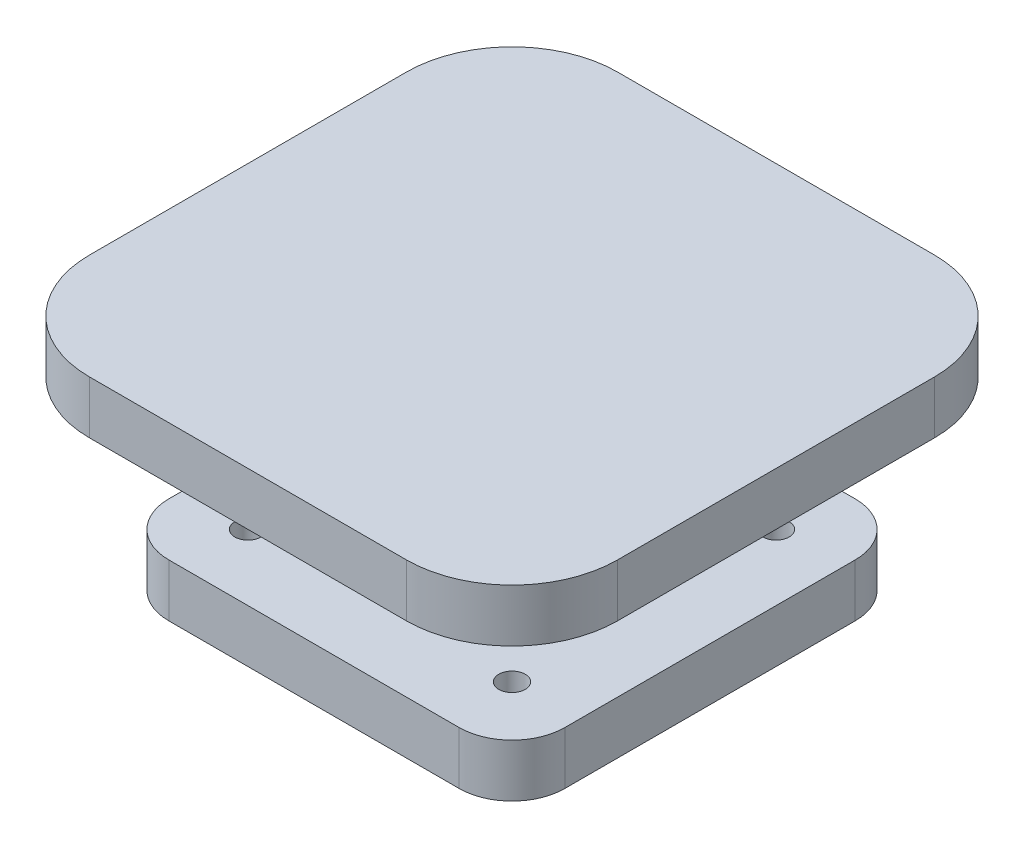
ISO-10303-21;
HEADER;
FILE_DESCRIPTION(('STEP AP214'),'2;1');
FILE_NAME('part.step','',(''),(''),'','','');
FILE_SCHEMA(('AUTOMOTIVE_DESIGN { 1 0 10303 214 1 1 1 1 }'));
ENDSEC;
DATA;
#1=APPLICATION_CONTEXT('core data for automotive mechanical design processes');
#2=APPLICATION_PROTOCOL_DEFINITION('international standard','automotive_design',2000,#1);
#3=PRODUCT_CONTEXT('',#1,'mechanical');
#4=PRODUCT('Part','Part','',(#3));
#5=PRODUCT_RELATED_PRODUCT_CATEGORY('part','',(#4));
#6=PRODUCT_DEFINITION_FORMATION('','',#4);
#7=PRODUCT_DEFINITION_CONTEXT('part definition',#1,'design');
#8=PRODUCT_DEFINITION('design','',#6,#7);
#9=PRODUCT_DEFINITION_SHAPE('','',#8);
#10=(LENGTH_UNIT() NAMED_UNIT(*) SI_UNIT(.MILLI.,.METRE.));
#11=(NAMED_UNIT(*) PLANE_ANGLE_UNIT() SI_UNIT($,.RADIAN.));
#12=(NAMED_UNIT(*) SI_UNIT($,.STERADIAN.) SOLID_ANGLE_UNIT());
#13=UNCERTAINTY_MEASURE_WITH_UNIT(LENGTH_MEASURE(1.E-05),#10,'distance_accuracy_value','');
#14=(GEOMETRIC_REPRESENTATION_CONTEXT(3) GLOBAL_UNCERTAINTY_ASSIGNED_CONTEXT((#13)) GLOBAL_UNIT_ASSIGNED_CONTEXT((#10,
#11,#12)) REPRESENTATION_CONTEXT('',''));
#15=CARTESIAN_POINT('',(0.,0.,0.));
#16=DIRECTION('',(0.,0.,1.));
#17=DIRECTION('',(1.,0.,0.));
#18=AXIS2_PLACEMENT_3D('',#15,#16,#17);
#19=CARTESIAN_POINT('',(0.,20.,75.));
#20=DIRECTION('',(0.,0.,-1.));
#21=DIRECTION('',(-1.,0.,0.));
#22=AXIS2_PLACEMENT_3D('',#19,#20,#21);
#23=PLANE('',#22);
#24=DIRECTION('',(1.,0.,0.));
#25=VECTOR('',#24,1.);
#26=CARTESIAN_POINT('',(0.,0.,75.));
#27=LINE('',#26,#25);
#28=CARTESIAN_POINT('',(-55.,0.,75.));
#29=VERTEX_POINT('',#28);
#30=CARTESIAN_POINT('',(55.,0.,75.));
#31=VERTEX_POINT('',#30);
#32=EDGE_CURVE('E162',#29,#31,#27,.T.);
#33=ORIENTED_EDGE('',*,*,#32,.T.);
#34=DIRECTION('',(0.,-1.,0.));
#35=VECTOR('',#34,1.);
#36=CARTESIAN_POINT('',(55.,20.,75.));
#37=LINE('',#36,#35);
#38=CARTESIAN_POINT('',(55.,20.,75.));
#39=VERTEX_POINT('',#38);
#40=EDGE_CURVE('E231',#31,#39,#37,.F.);
#41=ORIENTED_EDGE('',*,*,#40,.T.);
#42=DIRECTION('',(1.,0.,0.));
#43=VECTOR('',#42,1.);
#44=CARTESIAN_POINT('',(0.,20.,75.));
#45=LINE('',#44,#43);
#46=CARTESIAN_POINT('',(-55.,20.,75.));
#47=VERTEX_POINT('',#46);
#48=EDGE_CURVE('E344',#47,#39,#45,.T.);
#49=ORIENTED_EDGE('',*,*,#48,.F.);
#50=DIRECTION('',(0.,-1.,0.));
#51=VECTOR('',#50,1.);
#52=CARTESIAN_POINT('',(-55.,0.,75.));
#53=LINE('',#52,#51);
#54=EDGE_CURVE('E228',#47,#29,#53,.T.);
#55=ORIENTED_EDGE('',*,*,#54,.T.);
#56=EDGE_LOOP('',(#33,#41,#49,#55));
#57=FACE_BOUND('',#56,.T.);
#58=ADVANCED_FACE('F41',(#57),#23,.F.);
#59=CARTESIAN_POINT('',(75.,20.,0.));
#60=DIRECTION('',(-1.,0.,0.));
#61=DIRECTION('',(0.,0.,1.));
#62=AXIS2_PLACEMENT_3D('',#59,#60,#61);
#63=PLANE('',#62);
#64=DIRECTION('',(0.,0.,-1.));
#65=VECTOR('',#64,1.);
#66=CARTESIAN_POINT('',(75.,0.,0.));
#67=LINE('',#66,#65);
#68=CARTESIAN_POINT('',(75.,0.,55.));
#69=VERTEX_POINT('',#68);
#70=CARTESIAN_POINT('',(75.,0.,-55.));
#71=VERTEX_POINT('',#70);
#72=EDGE_CURVE('E372',#69,#71,#67,.T.);
#73=ORIENTED_EDGE('',*,*,#72,.T.);
#74=DIRECTION('',(0.,-1.,0.));
#75=VECTOR('',#74,1.);
#76=CARTESIAN_POINT('',(75.,20.,-55.));
#77=LINE('',#76,#75);
#78=CARTESIAN_POINT('',(75.,20.,-55.));
#79=VERTEX_POINT('',#78);
#80=EDGE_CURVE('E225',#71,#79,#77,.F.);
#81=ORIENTED_EDGE('',*,*,#80,.T.);
#82=DIRECTION('',(0.,0.,-1.));
#83=VECTOR('',#82,1.);
#84=CARTESIAN_POINT('',(75.,20.,0.));
#85=LINE('',#84,#83);
#86=CARTESIAN_POINT('',(75.,20.,55.));
#87=VERTEX_POINT('',#86);
#88=EDGE_CURVE('E348',#87,#79,#85,.T.);
#89=ORIENTED_EDGE('',*,*,#88,.F.);
#90=DIRECTION('',(0.,-1.,0.));
#91=VECTOR('',#90,1.);
#92=CARTESIAN_POINT('',(75.,20.,55.));
#93=LINE('',#92,#91);
#94=EDGE_CURVE('E221',#87,#69,#93,.T.);
#95=ORIENTED_EDGE('',*,*,#94,.T.);
#96=EDGE_LOOP('',(#73,#81,#89,#95));
#97=FACE_BOUND('',#96,.T.);
#98=ADVANCED_FACE('F395',(#97),#63,.F.);
#99=CARTESIAN_POINT('',(0.,20.,-75.));
#100=DIRECTION('',(0.,0.,-1.));
#101=DIRECTION('',(-1.,0.,0.));
#102=AXIS2_PLACEMENT_3D('',#99,#100,#101);
#103=PLANE('',#102);
#104=DIRECTION('',(1.,0.,0.));
#105=VECTOR('',#104,1.);
#106=CARTESIAN_POINT('',(0.,0.,-75.));
#107=LINE('',#106,#105);
#108=CARTESIAN_POINT('',(-55.,0.,-75.));
#109=VERTEX_POINT('',#108);
#110=CARTESIAN_POINT('',(55.,0.,-75.));
#111=VERTEX_POINT('',#110);
#112=EDGE_CURVE('E180',#109,#111,#107,.T.);
#113=ORIENTED_EDGE('',*,*,#112,.F.);
#114=DIRECTION('',(0.,-1.,0.));
#115=VECTOR('',#114,1.);
#116=CARTESIAN_POINT('',(-55.,20.,-75.));
#117=LINE('',#116,#115);
#118=CARTESIAN_POINT('',(-55.,20.,-75.));
#119=VERTEX_POINT('',#118);
#120=EDGE_CURVE('E207',#109,#119,#117,.F.);
#121=ORIENTED_EDGE('',*,*,#120,.T.);
#122=DIRECTION('',(1.,0.,0.));
#123=VECTOR('',#122,1.);
#124=CARTESIAN_POINT('',(0.,20.,-75.));
#125=LINE('',#124,#123);
#126=CARTESIAN_POINT('',(55.,20.,-75.));
#127=VERTEX_POINT('',#126);
#128=EDGE_CURVE('E191',#119,#127,#125,.T.);
#129=ORIENTED_EDGE('',*,*,#128,.T.);
#130=DIRECTION('',(0.,-1.,0.));
#131=VECTOR('',#130,1.);
#132=CARTESIAN_POINT('',(55.,0.,-75.));
#133=LINE('',#132,#131);
#134=EDGE_CURVE('E203',#127,#111,#133,.T.);
#135=ORIENTED_EDGE('',*,*,#134,.T.);
#136=EDGE_LOOP('',(#113,#121,#129,#135));
#137=FACE_BOUND('',#136,.T.);
#138=ADVANCED_FACE('F381',(#137),#103,.T.);
#139=CARTESIAN_POINT('',(50.,20.,50.));
#140=DIRECTION('',(0.,-1.,0.));
#141=DIRECTION('',(0.,0.,-1.));
#142=AXIS2_PLACEMENT_3D('',#139,#140,#141);
#143=CYLINDRICAL_SURFACE('',#142,5.);
#144=CARTESIAN_POINT('',(50.,20.,50.));
#145=DIRECTION('',(0.,1.,0.));
#146=DIRECTION('',(0.,0.,1.));
#147=AXIS2_PLACEMENT_3D('',#144,#145,#146);
#148=CIRCLE('',#147,5.);
#149=CARTESIAN_POINT('',(50.,20.,55.));
#150=VERTEX_POINT('',#149);
#151=EDGE_CURVE('E340',#150,#150,#148,.T.);
#152=ORIENTED_EDGE('',*,*,#151,.T.);
#153=EDGE_LOOP('',(#152));
#154=FACE_BOUND('',#153,.T.);
#155=CARTESIAN_POINT('',(50.,0.,50.));
#156=DIRECTION('',(0.,1.,0.));
#157=DIRECTION('',(0.,0.,1.));
#158=AXIS2_PLACEMENT_3D('',#155,#156,#157);
#159=CIRCLE('',#158,5.);
#160=CARTESIAN_POINT('',(50.,0.,55.));
#161=VERTEX_POINT('',#160);
#162=EDGE_CURVE('E366',#161,#161,#159,.T.);
#163=ORIENTED_EDGE('',*,*,#162,.F.);
#164=EDGE_LOOP('',(#163));
#165=FACE_BOUND('',#164,.T.);
#166=ADVANCED_FACE('F411',(#154,#165),#143,.F.);
#167=CARTESIAN_POINT('',(-50.,20.,50.));
#168=DIRECTION('',(0.,-1.,0.));
#169=DIRECTION('',(0.,0.,-1.));
#170=AXIS2_PLACEMENT_3D('',#167,#168,#169);
#171=CYLINDRICAL_SURFACE('',#170,5.);
#172=CARTESIAN_POINT('',(-50.,20.,50.));
#173=DIRECTION('',(0.,1.,0.));
#174=DIRECTION('',(0.,0.,1.));
#175=AXIS2_PLACEMENT_3D('',#172,#173,#174);
#176=CIRCLE('',#175,5.);
#177=CARTESIAN_POINT('',(-50.,20.,55.));
#178=VERTEX_POINT('',#177);
#179=EDGE_CURVE('E336',#178,#178,#176,.T.);
#180=ORIENTED_EDGE('',*,*,#179,.T.);
#181=EDGE_LOOP('',(#180));
#182=FACE_BOUND('',#181,.T.);
#183=CARTESIAN_POINT('',(-50.,0.,50.));
#184=DIRECTION('',(0.,1.,0.));
#185=DIRECTION('',(0.,0.,1.));
#186=AXIS2_PLACEMENT_3D('',#183,#184,#185);
#187=CIRCLE('',#186,5.);
#188=CARTESIAN_POINT('',(-50.,0.,55.));
#189=VERTEX_POINT('',#188);
#190=EDGE_CURVE('E362',#189,#189,#187,.T.);
#191=ORIENTED_EDGE('',*,*,#190,.F.);
#192=EDGE_LOOP('',(#191));
#193=FACE_BOUND('',#192,.T.);
#194=ADVANCED_FACE('F414',(#182,#193),#171,.F.);
#195=CARTESIAN_POINT('',(50.,20.,-50.));
#196=DIRECTION('',(0.,-1.,0.));
#197=DIRECTION('',(0.,0.,-1.));
#198=AXIS2_PLACEMENT_3D('',#195,#196,#197);
#199=CYLINDRICAL_SURFACE('',#198,5.);
#200=CARTESIAN_POINT('',(50.,20.,-50.));
#201=DIRECTION('',(0.,1.,0.));
#202=DIRECTION('',(0.,0.,1.));
#203=AXIS2_PLACEMENT_3D('',#200,#201,#202);
#204=CIRCLE('',#203,5.);
#205=CARTESIAN_POINT('',(50.,20.,-45.));
#206=VERTEX_POINT('',#205);
#207=EDGE_CURVE('E332',#206,#206,#204,.T.);
#208=ORIENTED_EDGE('',*,*,#207,.T.);
#209=EDGE_LOOP('',(#208));
#210=FACE_BOUND('',#209,.T.);
#211=CARTESIAN_POINT('',(50.,0.,-50.));
#212=DIRECTION('',(0.,1.,0.));
#213=DIRECTION('',(0.,0.,1.));
#214=AXIS2_PLACEMENT_3D('',#211,#212,#213);
#215=CIRCLE('',#214,5.);
#216=CARTESIAN_POINT('',(50.,0.,-45.));
#217=VERTEX_POINT('',#216);
#218=EDGE_CURVE('E358',#217,#217,#215,.T.);
#219=ORIENTED_EDGE('',*,*,#218,.F.);
#220=EDGE_LOOP('',(#219));
#221=FACE_BOUND('',#220,.T.);
#222=ADVANCED_FACE('F418',(#210,#221),#199,.F.);
#223=CARTESIAN_POINT('',(-50.,20.,-50.));
#224=DIRECTION('',(0.,-1.,0.));
#225=DIRECTION('',(0.,0.,-1.));
#226=AXIS2_PLACEMENT_3D('',#223,#224,#225);
#227=CYLINDRICAL_SURFACE('',#226,5.);
#228=CARTESIAN_POINT('',(-50.,20.,-50.));
#229=DIRECTION('',(0.,1.,0.));
#230=DIRECTION('',(0.,0.,1.));
#231=AXIS2_PLACEMENT_3D('',#228,#229,#230);
#232=CIRCLE('',#231,5.);
#233=CARTESIAN_POINT('',(-50.,20.,-45.));
#234=VERTEX_POINT('',#233);
#235=EDGE_CURVE('E179',#234,#234,#232,.T.);
#236=ORIENTED_EDGE('',*,*,#235,.T.);
#237=EDGE_LOOP('',(#236));
#238=FACE_BOUND('',#237,.T.);
#239=CARTESIAN_POINT('',(-50.,0.,-50.));
#240=DIRECTION('',(0.,1.,0.));
#241=DIRECTION('',(0.,0.,1.));
#242=AXIS2_PLACEMENT_3D('',#239,#240,#241);
#243=CIRCLE('',#242,5.);
#244=CARTESIAN_POINT('',(-50.,0.,-45.));
#245=VERTEX_POINT('',#244);
#246=EDGE_CURVE('E323',#245,#245,#243,.T.);
#247=ORIENTED_EDGE('',*,*,#246,.F.);
#248=EDGE_LOOP('',(#247));
#249=FACE_BOUND('',#248,.T.);
#250=ADVANCED_FACE('F422',(#238,#249),#227,.F.);
#251=CARTESIAN_POINT('',(-75.,20.,0.));
#252=DIRECTION('',(-1.,0.,0.));
#253=DIRECTION('',(0.,0.,1.));
#254=AXIS2_PLACEMENT_3D('',#251,#252,#253);
#255=PLANE('',#254);
#256=DIRECTION('',(0.,0.,-1.));
#257=VECTOR('',#256,1.);
#258=CARTESIAN_POINT('',(-75.,20.,0.));
#259=LINE('',#258,#257);
#260=CARTESIAN_POINT('',(-75.,20.,55.));
#261=VERTEX_POINT('',#260);
#262=CARTESIAN_POINT('',(-75.,20.,-55.));
#263=VERTEX_POINT('',#262);
#264=EDGE_CURVE('E186',#261,#263,#259,.T.);
#265=ORIENTED_EDGE('',*,*,#264,.T.);
#266=DIRECTION('',(0.,-1.,0.));
#267=VECTOR('',#266,1.);
#268=CARTESIAN_POINT('',(-75.,20.,-55.));
#269=LINE('',#268,#267);
#270=CARTESIAN_POINT('',(-75.,0.,-55.));
#271=VERTEX_POINT('',#270);
#272=EDGE_CURVE('E169',#263,#271,#269,.T.);
#273=ORIENTED_EDGE('',*,*,#272,.T.);
#274=DIRECTION('',(0.,0.,-1.));
#275=VECTOR('',#274,1.);
#276=CARTESIAN_POINT('',(-75.,0.,0.));
#277=LINE('',#276,#275);
#278=CARTESIAN_POINT('',(-75.,0.,55.));
#279=VERTEX_POINT('',#278);
#280=EDGE_CURVE('E160',#279,#271,#277,.T.);
#281=ORIENTED_EDGE('',*,*,#280,.F.);
#282=DIRECTION('',(0.,-1.,0.));
#283=VECTOR('',#282,1.);
#284=CARTESIAN_POINT('',(-75.,20.,55.));
#285=LINE('',#284,#283);
#286=EDGE_CURVE('E175',#279,#261,#285,.F.);
#287=ORIENTED_EDGE('',*,*,#286,.T.);
#288=EDGE_LOOP('',(#265,#273,#281,#287));
#289=FACE_BOUND('',#288,.T.);
#290=ADVANCED_FACE('F174',(#289),#255,.T.);
#291=CARTESIAN_POINT('',(0.,20.,0.));
#292=DIRECTION('',(0.,1.,0.));
#293=DIRECTION('',(0.,0.,1.));
#294=AXIS2_PLACEMENT_3D('',#291,#292,#293);
#295=PLANE('',#294);
#296=CARTESIAN_POINT('',(0.,20.,0.));
#297=DIRECTION('',(0.,1.,0.));
#298=DIRECTION('',(0.,0.,1.));
#299=AXIS2_PLACEMENT_3D('',#296,#297,#298);
#300=CIRCLE('',#299,50.);
#301=CARTESIAN_POINT('',(0.,20.,50.));
#302=VERTEX_POINT('',#301);
#303=EDGE_CURVE('E324',#302,#302,#300,.T.);
#304=ORIENTED_EDGE('',*,*,#303,.F.);
#305=EDGE_LOOP('',(#304));
#306=FACE_BOUND('',#305,.T.);
#307=ORIENTED_EDGE('',*,*,#235,.F.);
#308=EDGE_LOOP('',(#307));
#309=FACE_BOUND('',#308,.T.);
#310=ORIENTED_EDGE('',*,*,#207,.F.);
#311=EDGE_LOOP('',(#310));
#312=FACE_BOUND('',#311,.T.);
#313=ORIENTED_EDGE('',*,*,#179,.F.);
#314=EDGE_LOOP('',(#313));
#315=FACE_BOUND('',#314,.T.);
#316=ORIENTED_EDGE('',*,*,#151,.F.);
#317=EDGE_LOOP('',(#316));
#318=FACE_BOUND('',#317,.T.);
#319=ORIENTED_EDGE('',*,*,#128,.F.);
#320=CARTESIAN_POINT('',(-55.,20.,-55.));
#321=DIRECTION('',(0.,1.,0.));
#322=DIRECTION('',(0.,0.,1.));
#323=AXIS2_PLACEMENT_3D('',#320,#321,#322);
#324=CIRCLE('',#323,20.);
#325=EDGE_CURVE('E218',#119,#263,#324,.T.);
#326=ORIENTED_EDGE('',*,*,#325,.T.);
#327=ORIENTED_EDGE('',*,*,#264,.F.);
#328=CARTESIAN_POINT('',(-55.,20.,55.));
#329=DIRECTION('',(0.,1.,0.));
#330=DIRECTION('',(0.,0.,1.));
#331=AXIS2_PLACEMENT_3D('',#328,#329,#330);
#332=CIRCLE('',#331,20.);
#333=EDGE_CURVE('E184',#261,#47,#332,.T.);
#334=ORIENTED_EDGE('',*,*,#333,.T.);
#335=ORIENTED_EDGE('',*,*,#48,.T.);
#336=CARTESIAN_POINT('',(55.,20.,55.));
#337=DIRECTION('',(0.,1.,0.));
#338=DIRECTION('',(0.,0.,1.));
#339=AXIS2_PLACEMENT_3D('',#336,#337,#338);
#340=CIRCLE('',#339,20.);
#341=EDGE_CURVE('E212',#39,#87,#340,.T.);
#342=ORIENTED_EDGE('',*,*,#341,.T.);
#343=ORIENTED_EDGE('',*,*,#88,.T.);
#344=CARTESIAN_POINT('',(55.,20.,-55.));
#345=DIRECTION('',(0.,1.,0.));
#346=DIRECTION('',(0.,0.,1.));
#347=AXIS2_PLACEMENT_3D('',#344,#345,#346);
#348=CIRCLE('',#347,20.);
#349=EDGE_CURVE('E215',#79,#127,#348,.T.);
#350=ORIENTED_EDGE('',*,*,#349,.T.);
#351=EDGE_LOOP('',(#319,#326,#327,#334,#335,#342,#343,#350));
#352=FACE_BOUND('',#351,.T.);
#353=ADVANCED_FACE('F388',(#306,#309,#312,#315,#318,#352),#295,.T.);
#354=CARTESIAN_POINT('',(0.,0.,0.));
#355=DIRECTION('',(0.,1.,0.));
#356=DIRECTION('',(0.,0.,1.));
#357=AXIS2_PLACEMENT_3D('',#354,#355,#356);
#358=PLANE('',#357);
#359=ORIENTED_EDGE('',*,*,#246,.T.);
#360=EDGE_LOOP('',(#359));
#361=FACE_BOUND('',#360,.T.);
#362=ORIENTED_EDGE('',*,*,#218,.T.);
#363=EDGE_LOOP('',(#362));
#364=FACE_BOUND('',#363,.T.);
#365=ORIENTED_EDGE('',*,*,#190,.T.);
#366=EDGE_LOOP('',(#365));
#367=FACE_BOUND('',#366,.T.);
#368=ORIENTED_EDGE('',*,*,#162,.T.);
#369=EDGE_LOOP('',(#368));
#370=FACE_BOUND('',#369,.T.);
#371=ORIENTED_EDGE('',*,*,#280,.T.);
#372=CARTESIAN_POINT('',(-55.,0.,-55.));
#373=DIRECTION('',(0.,1.,0.));
#374=DIRECTION('',(0.,0.,1.));
#375=AXIS2_PLACEMENT_3D('',#372,#373,#374);
#376=CIRCLE('',#375,20.);
#377=EDGE_CURVE('E200',#271,#109,#376,.F.);
#378=ORIENTED_EDGE('',*,*,#377,.T.);
#379=ORIENTED_EDGE('',*,*,#112,.T.);
#380=CARTESIAN_POINT('',(55.,0.,-55.));
#381=DIRECTION('',(0.,1.,0.));
#382=DIRECTION('',(0.,0.,1.));
#383=AXIS2_PLACEMENT_3D('',#380,#381,#382);
#384=CIRCLE('',#383,20.);
#385=EDGE_CURVE('E197',#111,#71,#384,.F.);
#386=ORIENTED_EDGE('',*,*,#385,.T.);
#387=ORIENTED_EDGE('',*,*,#72,.F.);
#388=CARTESIAN_POINT('',(55.,0.,55.));
#389=DIRECTION('',(0.,1.,0.));
#390=DIRECTION('',(0.,0.,1.));
#391=AXIS2_PLACEMENT_3D('',#388,#389,#390);
#392=CIRCLE('',#391,20.);
#393=EDGE_CURVE('E168',#69,#31,#392,.F.);
#394=ORIENTED_EDGE('',*,*,#393,.T.);
#395=ORIENTED_EDGE('',*,*,#32,.F.);
#396=CARTESIAN_POINT('',(-55.,0.,55.));
#397=DIRECTION('',(0.,1.,0.));
#398=DIRECTION('',(0.,0.,1.));
#399=AXIS2_PLACEMENT_3D('',#396,#397,#398);
#400=CIRCLE('',#399,20.);
#401=EDGE_CURVE('E157',#29,#279,#400,.F.);
#402=ORIENTED_EDGE('',*,*,#401,.T.);
#403=EDGE_LOOP('',(#371,#378,#379,#386,#387,#394,#395,#402));
#404=FACE_BOUND('',#403,.T.);
#405=ADVANCED_FACE('F159',(#361,#364,#367,#370,#404),#358,.F.);
#406=CARTESIAN_POINT('',(-55.,20.,-55.));
#407=DIRECTION('',(0.,-1.,0.));
#408=DIRECTION('',(0.,0.,-1.));
#409=AXIS2_PLACEMENT_3D('',#406,#407,#408);
#410=CYLINDRICAL_SURFACE('',#409,20.);
#411=ORIENTED_EDGE('',*,*,#325,.F.);
#412=ORIENTED_EDGE('',*,*,#120,.F.);
#413=ORIENTED_EDGE('',*,*,#377,.F.);
#414=ORIENTED_EDGE('',*,*,#272,.F.);
#415=EDGE_LOOP('',(#411,#412,#413,#414));
#416=FACE_BOUND('',#415,.T.);
#417=ADVANCED_FACE('F386',(#416),#410,.T.);
#418=CARTESIAN_POINT('',(55.,20.,-55.));
#419=DIRECTION('',(0.,1.,0.));
#420=DIRECTION('',(0.,0.,1.));
#421=AXIS2_PLACEMENT_3D('',#418,#419,#420);
#422=CYLINDRICAL_SURFACE('',#421,20.);
#423=ORIENTED_EDGE('',*,*,#349,.F.);
#424=ORIENTED_EDGE('',*,*,#80,.F.);
#425=ORIENTED_EDGE('',*,*,#385,.F.);
#426=ORIENTED_EDGE('',*,*,#134,.F.);
#427=EDGE_LOOP('',(#423,#424,#425,#426));
#428=FACE_BOUND('',#427,.T.);
#429=ADVANCED_FACE('F391',(#428),#422,.T.);
#430=CARTESIAN_POINT('',(55.,20.,55.));
#431=DIRECTION('',(0.,-1.,0.));
#432=DIRECTION('',(0.,0.,-1.));
#433=AXIS2_PLACEMENT_3D('',#430,#431,#432);
#434=CYLINDRICAL_SURFACE('',#433,20.);
#435=ORIENTED_EDGE('',*,*,#341,.F.);
#436=ORIENTED_EDGE('',*,*,#40,.F.);
#437=ORIENTED_EDGE('',*,*,#393,.F.);
#438=ORIENTED_EDGE('',*,*,#94,.F.);
#439=EDGE_LOOP('',(#435,#436,#437,#438));
#440=FACE_BOUND('',#439,.T.);
#441=ADVANCED_FACE('F401',(#440),#434,.T.);
#442=CARTESIAN_POINT('',(-55.,20.,55.));
#443=DIRECTION('',(0.,1.,0.));
#444=DIRECTION('',(0.,0.,1.));
#445=AXIS2_PLACEMENT_3D('',#442,#443,#444);
#446=CYLINDRICAL_SURFACE('',#445,20.);
#447=ORIENTED_EDGE('',*,*,#333,.F.);
#448=ORIENTED_EDGE('',*,*,#286,.F.);
#449=ORIENTED_EDGE('',*,*,#401,.F.);
#450=ORIENTED_EDGE('',*,*,#54,.F.);
#451=EDGE_LOOP('',(#447,#448,#449,#450));
#452=FACE_BOUND('',#451,.T.);
#453=ADVANCED_FACE('F183',(#452),#446,.T.);
#454=CARTESIAN_POINT('',(0.,70.,0.));
#455=DIRECTION('',(0.,-1.,0.));
#456=DIRECTION('',(0.,0.,-1.));
#457=AXIS2_PLACEMENT_3D('',#454,#455,#456);
#458=CYLINDRICAL_SURFACE('',#457,50.);
#459=CARTESIAN_POINT('',(0.,70.,0.));
#460=DIRECTION('',(0.,1.,0.));
#461=DIRECTION('',(0.,0.,1.));
#462=AXIS2_PLACEMENT_3D('',#459,#460,#461);
#463=CIRCLE('',#462,50.);
#464=CARTESIAN_POINT('',(0.,70.,50.));
#465=VERTEX_POINT('',#464);
#466=EDGE_CURVE('E319',#465,#465,#463,.T.);
#467=ORIENTED_EDGE('',*,*,#466,.F.);
#468=EDGE_LOOP('',(#467));
#469=FACE_BOUND('',#468,.T.);
#470=ORIENTED_EDGE('',*,*,#303,.T.);
#471=EDGE_LOOP('',(#470));
#472=FACE_BOUND('',#471,.T.);
#473=ADVANCED_FACE('F435',(#469,#472),#458,.T.);
#474=CARTESIAN_POINT('',(100.,90.,100.));
#475=DIRECTION('',(-1.,0.,0.));
#476=DIRECTION('',(0.,0.,1.));
#477=AXIS2_PLACEMENT_3D('',#474,#475,#476);
#478=PLANE('',#477);
#479=DIRECTION('',(0.,0.,-1.));
#480=VECTOR('',#479,1.);
#481=CARTESIAN_POINT('',(100.,90.,100.));
#482=LINE('',#481,#480);
#483=CARTESIAN_POINT('',(100.,90.,60.));
#484=VERTEX_POINT('',#483);
#485=CARTESIAN_POINT('',(100.,90.,-60.));
#486=VERTEX_POINT('',#485);
#487=EDGE_CURVE('E283',#484,#486,#482,.T.);
#488=ORIENTED_EDGE('',*,*,#487,.F.);
#489=DIRECTION('',(0.,-1.,0.));
#490=VECTOR('',#489,1.);
#491=CARTESIAN_POINT('',(100.,90.,60.));
#492=LINE('',#491,#490);
#493=CARTESIAN_POINT('',(100.,70.,60.));
#494=VERTEX_POINT('',#493);
#495=EDGE_CURVE('E11',#484,#494,#492,.T.);
#496=ORIENTED_EDGE('',*,*,#495,.T.);
#497=DIRECTION('',(0.,0.,-1.));
#498=VECTOR('',#497,1.);
#499=CARTESIAN_POINT('',(100.,70.,100.));
#500=LINE('',#499,#498);
#501=CARTESIAN_POINT('',(100.,70.,-60.));
#502=VERTEX_POINT('',#501);
#503=EDGE_CURVE('E286',#494,#502,#500,.T.);
#504=ORIENTED_EDGE('',*,*,#503,.T.);
#505=DIRECTION('',(0.,-1.,0.));
#506=VECTOR('',#505,1.);
#507=CARTESIAN_POINT('',(100.,90.,-60.));
#508=LINE('',#507,#506);
#509=EDGE_CURVE('E50',#502,#486,#508,.F.);
#510=ORIENTED_EDGE('',*,*,#509,.T.);
#511=EDGE_LOOP('',(#488,#496,#504,#510));
#512=FACE_BOUND('',#511,.T.);
#513=ADVANCED_FACE('F282',(#512),#478,.F.);
#514=CARTESIAN_POINT('',(-100.,90.,-100.));
#515=DIRECTION('',(0.,0.,1.));
#516=DIRECTION('',(1.,0.,0.));
#517=AXIS2_PLACEMENT_3D('',#514,#515,#516);
#518=PLANE('',#517);
#519=DIRECTION('',(-1.,0.,0.));
#520=VECTOR('',#519,1.);
#521=CARTESIAN_POINT('',(-100.,70.,-100.));
#522=LINE('',#521,#520);
#523=CARTESIAN_POINT('',(60.,70.,-100.));
#524=VERTEX_POINT('',#523);
#525=CARTESIAN_POINT('',(-60.,70.,-100.));
#526=VERTEX_POINT('',#525);
#527=EDGE_CURVE('E302',#524,#526,#522,.T.);
#528=ORIENTED_EDGE('',*,*,#527,.T.);
#529=DIRECTION('',(0.,-1.,0.));
#530=VECTOR('',#529,1.);
#531=CARTESIAN_POINT('',(-60.,90.,-100.));
#532=LINE('',#531,#530);
#533=CARTESIAN_POINT('',(-60.,90.,-100.));
#534=VERTEX_POINT('',#533);
#535=EDGE_CURVE('E257',#526,#534,#532,.F.);
#536=ORIENTED_EDGE('',*,*,#535,.T.);
#537=DIRECTION('',(-1.,0.,0.));
#538=VECTOR('',#537,1.);
#539=CARTESIAN_POINT('',(-100.,90.,-100.));
#540=LINE('',#539,#538);
#541=CARTESIAN_POINT('',(60.,90.,-100.));
#542=VERTEX_POINT('',#541);
#543=EDGE_CURVE('E294',#542,#534,#540,.T.);
#544=ORIENTED_EDGE('',*,*,#543,.F.);
#545=DIRECTION('',(0.,-1.,0.));
#546=VECTOR('',#545,1.);
#547=CARTESIAN_POINT('',(60.,90.,-100.));
#548=LINE('',#547,#546);
#549=EDGE_CURVE('E253',#542,#524,#548,.T.);
#550=ORIENTED_EDGE('',*,*,#549,.T.);
#551=EDGE_LOOP('',(#528,#536,#544,#550));
#552=FACE_BOUND('',#551,.T.);
#553=ADVANCED_FACE('F301',(#552),#518,.F.);
#554=CARTESIAN_POINT('',(-100.,90.,100.));
#555=DIRECTION('',(1.,0.,0.));
#556=DIRECTION('',(0.,0.,-1.));
#557=AXIS2_PLACEMENT_3D('',#554,#555,#556);
#558=PLANE('',#557);
#559=DIRECTION('',(0.,0.,1.));
#560=VECTOR('',#559,1.);
#561=CARTESIAN_POINT('',(-100.,90.,100.));
#562=LINE('',#561,#560);
#563=CARTESIAN_POINT('',(-100.,90.,-60.));
#564=VERTEX_POINT('',#563);
#565=CARTESIAN_POINT('',(-100.,90.,60.));
#566=VERTEX_POINT('',#565);
#567=EDGE_CURVE('E457',#564,#566,#562,.T.);
#568=ORIENTED_EDGE('',*,*,#567,.F.);
#569=DIRECTION('',(0.,-1.,0.));
#570=VECTOR('',#569,1.);
#571=CARTESIAN_POINT('',(-100.,90.,-60.));
#572=LINE('',#571,#570);
#573=CARTESIAN_POINT('',(-100.,70.,-60.));
#574=VERTEX_POINT('',#573);
#575=EDGE_CURVE('E237',#564,#574,#572,.T.);
#576=ORIENTED_EDGE('',*,*,#575,.T.);
#577=DIRECTION('',(0.,0.,1.));
#578=VECTOR('',#577,1.);
#579=CARTESIAN_POINT('',(-100.,70.,100.));
#580=LINE('',#579,#578);
#581=CARTESIAN_POINT('',(-100.,70.,60.));
#582=VERTEX_POINT('',#581);
#583=EDGE_CURVE('E308',#574,#582,#580,.T.);
#584=ORIENTED_EDGE('',*,*,#583,.T.);
#585=DIRECTION('',(0.,-1.,0.));
#586=VECTOR('',#585,1.);
#587=CARTESIAN_POINT('',(-100.,90.,60.));
#588=LINE('',#587,#586);
#589=EDGE_CURVE('E234',#582,#566,#588,.F.);
#590=ORIENTED_EDGE('',*,*,#589,.T.);
#591=EDGE_LOOP('',(#568,#576,#584,#590));
#592=FACE_BOUND('',#591,.T.);
#593=ADVANCED_FACE('F455',(#592),#558,.F.);
#594=CARTESIAN_POINT('',(-100.,90.,100.));
#595=DIRECTION('',(0.,0.,-1.));
#596=DIRECTION('',(-1.,0.,0.));
#597=AXIS2_PLACEMENT_3D('',#594,#595,#596);
#598=PLANE('',#597);
#599=DIRECTION('',(1.,0.,0.));
#600=VECTOR('',#599,1.);
#601=CARTESIAN_POINT('',(-100.,90.,100.));
#602=LINE('',#601,#600);
#603=CARTESIAN_POINT('',(-60.,90.,100.));
#604=VERTEX_POINT('',#603);
#605=CARTESIAN_POINT('',(60.,90.,100.));
#606=VERTEX_POINT('',#605);
#607=EDGE_CURVE('E328',#604,#606,#602,.T.);
#608=ORIENTED_EDGE('',*,*,#607,.F.);
#609=DIRECTION('',(0.,-1.,0.));
#610=VECTOR('',#609,1.);
#611=CARTESIAN_POINT('',(-60.,90.,100.));
#612=LINE('',#611,#610);
#613=CARTESIAN_POINT('',(-60.,70.,100.));
#614=VERTEX_POINT('',#613);
#615=EDGE_CURVE('E273',#604,#614,#612,.T.);
#616=ORIENTED_EDGE('',*,*,#615,.T.);
#617=DIRECTION('',(1.,0.,0.));
#618=VECTOR('',#617,1.);
#619=CARTESIAN_POINT('',(-100.,70.,100.));
#620=LINE('',#619,#618);
#621=CARTESIAN_POINT('',(60.,70.,100.));
#622=VERTEX_POINT('',#621);
#623=EDGE_CURVE('E295',#614,#622,#620,.T.);
#624=ORIENTED_EDGE('',*,*,#623,.T.);
#625=DIRECTION('',(0.,-1.,0.));
#626=VECTOR('',#625,1.);
#627=CARTESIAN_POINT('',(60.,90.,100.));
#628=LINE('',#627,#626);
#629=EDGE_CURVE('E57',#622,#606,#628,.F.);
#630=ORIENTED_EDGE('',*,*,#629,.T.);
#631=EDGE_LOOP('',(#608,#616,#624,#630));
#632=FACE_BOUND('',#631,.T.);
#633=ADVANCED_FACE('F450',(#632),#598,.F.);
#634=CARTESIAN_POINT('',(0.,90.,0.));
#635=DIRECTION('',(0.,-1.,0.));
#636=DIRECTION('',(0.,0.,-1.));
#637=AXIS2_PLACEMENT_3D('',#634,#635,#636);
#638=PLANE('',#637);
#639=ORIENTED_EDGE('',*,*,#543,.T.);
#640=CARTESIAN_POINT('',(-60.,90.,-60.));
#641=DIRECTION('',(0.,-1.,0.));
#642=DIRECTION('',(0.,0.,-1.));
#643=AXIS2_PLACEMENT_3D('',#640,#641,#642);
#644=CIRCLE('',#643,40.);
#645=EDGE_CURVE('E268',#534,#564,#644,.F.);
#646=ORIENTED_EDGE('',*,*,#645,.T.);
#647=ORIENTED_EDGE('',*,*,#567,.T.);
#648=CARTESIAN_POINT('',(-60.,90.,60.));
#649=DIRECTION('',(0.,-1.,0.));
#650=DIRECTION('',(0.,0.,-1.));
#651=AXIS2_PLACEMENT_3D('',#648,#649,#650);
#652=CIRCLE('',#651,40.);
#653=EDGE_CURVE('E64',#566,#604,#652,.F.);
#654=ORIENTED_EDGE('',*,*,#653,.T.);
#655=ORIENTED_EDGE('',*,*,#607,.T.);
#656=CARTESIAN_POINT('',(60.,90.,60.));
#657=DIRECTION('',(0.,-1.,0.));
#658=DIRECTION('',(0.,0.,-1.));
#659=AXIS2_PLACEMENT_3D('',#656,#657,#658);
#660=CIRCLE('',#659,40.);
#661=EDGE_CURVE('E263',#606,#484,#660,.F.);
#662=ORIENTED_EDGE('',*,*,#661,.T.);
#663=ORIENTED_EDGE('',*,*,#487,.T.);
#664=CARTESIAN_POINT('',(60.,90.,-60.));
#665=DIRECTION('',(0.,-1.,0.));
#666=DIRECTION('',(0.,0.,-1.));
#667=AXIS2_PLACEMENT_3D('',#664,#665,#666);
#668=CIRCLE('',#667,40.);
#669=EDGE_CURVE('E260',#486,#542,#668,.F.);
#670=ORIENTED_EDGE('',*,*,#669,.T.);
#671=EDGE_LOOP('',(#639,#646,#647,#654,#655,#662,#663,#670));
#672=FACE_BOUND('',#671,.T.);
#673=ADVANCED_FACE('F290',(#672),#638,.F.);
#674=CARTESIAN_POINT('',(0.,70.,0.));
#675=DIRECTION('',(0.,-1.,0.));
#676=DIRECTION('',(0.,0.,-1.));
#677=AXIS2_PLACEMENT_3D('',#674,#675,#676);
#678=PLANE('',#677);
#679=ORIENTED_EDGE('',*,*,#466,.T.);
#680=EDGE_LOOP('',(#679));
#681=FACE_BOUND('',#680,.T.);
#682=ORIENTED_EDGE('',*,*,#583,.F.);
#683=CARTESIAN_POINT('',(-60.,70.,-60.));
#684=DIRECTION('',(0.,-1.,0.));
#685=DIRECTION('',(0.,0.,-1.));
#686=AXIS2_PLACEMENT_3D('',#683,#684,#685);
#687=CIRCLE('',#686,40.);
#688=EDGE_CURVE('E250',#574,#526,#687,.T.);
#689=ORIENTED_EDGE('',*,*,#688,.T.);
#690=ORIENTED_EDGE('',*,*,#527,.F.);
#691=CARTESIAN_POINT('',(60.,70.,-60.));
#692=DIRECTION('',(0.,-1.,0.));
#693=DIRECTION('',(0.,0.,-1.));
#694=AXIS2_PLACEMENT_3D('',#691,#692,#693);
#695=CIRCLE('',#694,40.);
#696=EDGE_CURVE('E241',#524,#502,#695,.T.);
#697=ORIENTED_EDGE('',*,*,#696,.T.);
#698=ORIENTED_EDGE('',*,*,#503,.F.);
#699=CARTESIAN_POINT('',(60.,70.,60.));
#700=DIRECTION('',(0.,-1.,0.));
#701=DIRECTION('',(0.,0.,-1.));
#702=AXIS2_PLACEMENT_3D('',#699,#700,#701);
#703=CIRCLE('',#702,40.);
#704=EDGE_CURVE('E244',#494,#622,#703,.T.);
#705=ORIENTED_EDGE('',*,*,#704,.T.);
#706=ORIENTED_EDGE('',*,*,#623,.F.);
#707=CARTESIAN_POINT('',(-60.,70.,60.));
#708=DIRECTION('',(0.,-1.,0.));
#709=DIRECTION('',(0.,0.,-1.));
#710=AXIS2_PLACEMENT_3D('',#707,#708,#709);
#711=CIRCLE('',#710,40.);
#712=EDGE_CURVE('E247',#614,#582,#711,.T.);
#713=ORIENTED_EDGE('',*,*,#712,.T.);
#714=EDGE_LOOP('',(#682,#689,#690,#697,#698,#705,#706,#713));
#715=FACE_BOUND('',#714,.T.);
#716=ADVANCED_FACE('F306',(#681,#715),#678,.T.);
#717=CARTESIAN_POINT('',(-60.,90.,-60.));
#718=DIRECTION('',(0.,-1.,0.));
#719=DIRECTION('',(0.,0.,-1.));
#720=AXIS2_PLACEMENT_3D('',#717,#718,#719);
#721=CYLINDRICAL_SURFACE('',#720,40.);
#722=ORIENTED_EDGE('',*,*,#645,.F.);
#723=ORIENTED_EDGE('',*,*,#535,.F.);
#724=ORIENTED_EDGE('',*,*,#688,.F.);
#725=ORIENTED_EDGE('',*,*,#575,.F.);
#726=EDGE_LOOP('',(#722,#723,#724,#725));
#727=FACE_BOUND('',#726,.T.);
#728=ADVANCED_FACE('F436',(#727),#721,.T.);
#729=CARTESIAN_POINT('',(-60.,90.,60.));
#730=DIRECTION('',(0.,-1.,0.));
#731=DIRECTION('',(0.,0.,-1.));
#732=AXIS2_PLACEMENT_3D('',#729,#730,#731);
#733=CYLINDRICAL_SURFACE('',#732,40.);
#734=ORIENTED_EDGE('',*,*,#653,.F.);
#735=ORIENTED_EDGE('',*,*,#589,.F.);
#736=ORIENTED_EDGE('',*,*,#712,.F.);
#737=ORIENTED_EDGE('',*,*,#615,.F.);
#738=EDGE_LOOP('',(#734,#735,#736,#737));
#739=FACE_BOUND('',#738,.T.);
#740=ADVANCED_FACE('F439',(#739),#733,.T.);
#741=CARTESIAN_POINT('',(60.,90.,60.));
#742=DIRECTION('',(0.,-1.,0.));
#743=DIRECTION('',(0.,0.,-1.));
#744=AXIS2_PLACEMENT_3D('',#741,#742,#743);
#745=CYLINDRICAL_SURFACE('',#744,40.);
#746=ORIENTED_EDGE('',*,*,#661,.F.);
#747=ORIENTED_EDGE('',*,*,#629,.F.);
#748=ORIENTED_EDGE('',*,*,#704,.F.);
#749=ORIENTED_EDGE('',*,*,#495,.F.);
#750=EDGE_LOOP('',(#746,#747,#748,#749));
#751=FACE_BOUND('',#750,.T.);
#752=ADVANCED_FACE('F442',(#751),#745,.T.);
#753=CARTESIAN_POINT('',(60.,90.,-60.));
#754=DIRECTION('',(0.,-1.,0.));
#755=DIRECTION('',(0.,0.,-1.));
#756=AXIS2_PLACEMENT_3D('',#753,#754,#755);
#757=CYLINDRICAL_SURFACE('',#756,40.);
#758=ORIENTED_EDGE('',*,*,#669,.F.);
#759=ORIENTED_EDGE('',*,*,#509,.F.);
#760=ORIENTED_EDGE('',*,*,#696,.F.);
#761=ORIENTED_EDGE('',*,*,#549,.F.);
#762=EDGE_LOOP('',(#758,#759,#760,#761));
#763=FACE_BOUND('',#762,.T.);
#764=ADVANCED_FACE('F43',(#763),#757,.T.);
#765=CLOSED_SHELL('',(#58,#98,#138,#166,#194,#222,#250,#290,#353,#405,#417,#429,#441,#453,#473,
#513,#553,#593,#633,#673,#716,#728,#740,#752,#764));
#766=MANIFOLD_SOLID_BREP('B2',#765);
#767=ADVANCED_BREP_SHAPE_REPRESENTATION('',(#18,#766),#14);
#768=SHAPE_DEFINITION_REPRESENTATION(#9,#767);
ENDSEC;
END-ISO-10303-21;
